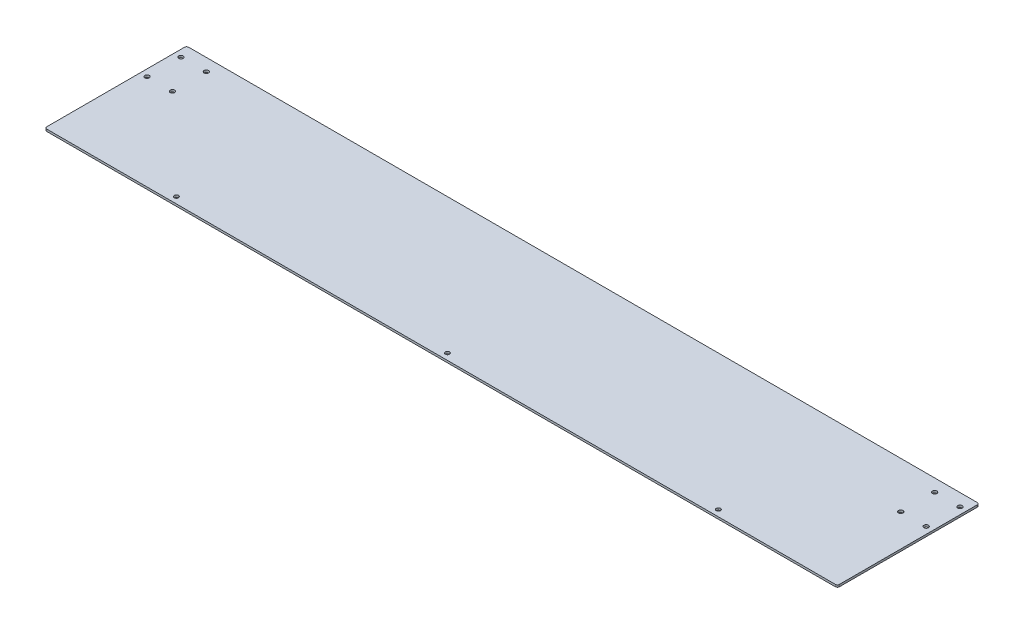
ISO-10303-21;
HEADER;
FILE_DESCRIPTION(('STEP AP214'),'2;1');
FILE_NAME('part.step','',(''),(''),'','','');
FILE_SCHEMA(('AUTOMOTIVE_DESIGN { 1 0 10303 214 1 1 1 1 }'));
ENDSEC;
DATA;
#1=APPLICATION_CONTEXT('core data for automotive mechanical design processes');
#2=APPLICATION_PROTOCOL_DEFINITION('international standard','automotive_design',2000,#1);
#3=PRODUCT_CONTEXT('',#1,'mechanical');
#4=PRODUCT('Part','Part','',(#3));
#5=PRODUCT_RELATED_PRODUCT_CATEGORY('part','',(#4));
#6=PRODUCT_DEFINITION_FORMATION('','',#4);
#7=PRODUCT_DEFINITION_CONTEXT('part definition',#1,'design');
#8=PRODUCT_DEFINITION('design','',#6,#7);
#9=PRODUCT_DEFINITION_SHAPE('','',#8);
#10=(LENGTH_UNIT() NAMED_UNIT(*) SI_UNIT(.MILLI.,.METRE.));
#11=(NAMED_UNIT(*) PLANE_ANGLE_UNIT() SI_UNIT($,.RADIAN.));
#12=(NAMED_UNIT(*) SI_UNIT($,.STERADIAN.) SOLID_ANGLE_UNIT());
#13=UNCERTAINTY_MEASURE_WITH_UNIT(LENGTH_MEASURE(1.E-05),#10,'distance_accuracy_value','');
#14=(GEOMETRIC_REPRESENTATION_CONTEXT(3) GLOBAL_UNCERTAINTY_ASSIGNED_CONTEXT((#13)) GLOBAL_UNIT_ASSIGNED_CONTEXT((#10,
#11,#12)) REPRESENTATION_CONTEXT('',''));
#15=CARTESIAN_POINT('',(0.,0.,0.));
#16=DIRECTION('',(0.,0.,1.));
#17=DIRECTION('',(1.,0.,0.));
#18=AXIS2_PLACEMENT_3D('',#15,#16,#17);
#19=CARTESIAN_POINT('',(591.185,3.175,-103.1875));
#20=DIRECTION('',(0.,-1.,0.));
#21=DIRECTION('',(0.,0.,-1.));
#22=AXIS2_PLACEMENT_3D('',#19,#20,#21);
#23=CYLINDRICAL_SURFACE('',#22,3.17500000000002);
#24=CARTESIAN_POINT('',(591.185,0.,-103.1875));
#25=DIRECTION('',(0.,1.,0.));
#26=DIRECTION('',(0.,0.,-1.));
#27=AXIS2_PLACEMENT_3D('',#24,#25,#26);
#28=CIRCLE('',#27,3.17500000000002);
#29=CARTESIAN_POINT('',(594.36,0.,-103.1875));
#30=VERTEX_POINT('',#29);
#31=CARTESIAN_POINT('',(591.185,0.,-106.3625));
#32=VERTEX_POINT('',#31);
#33=EDGE_CURVE('E132',#30,#32,#28,.T.);
#34=ORIENTED_EDGE('',*,*,#33,.T.);
#35=DIRECTION('',(0.,-1.,0.));
#36=VECTOR('',#35,1.);
#37=CARTESIAN_POINT('',(591.185,3.175,-106.3625));
#38=LINE('',#37,#36);
#39=CARTESIAN_POINT('',(591.185,3.175,-106.3625));
#40=VERTEX_POINT('',#39);
#41=EDGE_CURVE('E11',#40,#32,#38,.T.);
#42=ORIENTED_EDGE('',*,*,#41,.F.);
#43=CARTESIAN_POINT('',(591.185,3.175,-103.1875));
#44=DIRECTION('',(0.,1.,0.));
#45=DIRECTION('',(0.,0.,-1.));
#46=AXIS2_PLACEMENT_3D('',#43,#44,#45);
#47=CIRCLE('',#46,3.17500000000002);
#48=CARTESIAN_POINT('',(594.36,3.175,-103.1875));
#49=VERTEX_POINT('',#48);
#50=EDGE_CURVE('E147',#49,#40,#47,.T.);
#51=ORIENTED_EDGE('',*,*,#50,.F.);
#52=DIRECTION('',(0.,-1.,0.));
#53=VECTOR('',#52,1.);
#54=CARTESIAN_POINT('',(594.36,3.175,-103.1875));
#55=LINE('',#54,#53);
#56=EDGE_CURVE('E128',#49,#30,#55,.T.);
#57=ORIENTED_EDGE('',*,*,#56,.T.);
#58=EDGE_LOOP('',(#34,#42,#51,#57));
#59=FACE_BOUND('',#58,.T.);
#60=ADVANCED_FACE('F36',(#59),#23,.T.);
#61=CARTESIAN_POINT('',(-591.185,3.175,-106.3625));
#62=DIRECTION('',(0.,0.,1.));
#63=DIRECTION('',(1.,0.,0.));
#64=AXIS2_PLACEMENT_3D('',#61,#62,#63);
#65=PLANE('',#64);
#66=DIRECTION('',(-1.,0.,0.));
#67=VECTOR('',#66,1.);
#68=CARTESIAN_POINT('',(-591.185,0.,-106.3625));
#69=LINE('',#68,#67);
#70=CARTESIAN_POINT('',(-591.185,0.,-106.3625));
#71=VERTEX_POINT('',#70);
#72=EDGE_CURVE('E135',#32,#71,#69,.T.);
#73=ORIENTED_EDGE('',*,*,#72,.T.);
#74=DIRECTION('',(0.,-1.,0.));
#75=VECTOR('',#74,1.);
#76=CARTESIAN_POINT('',(-591.185,3.175,-106.3625));
#77=LINE('',#76,#75);
#78=CARTESIAN_POINT('',(-591.185,3.175,-106.3625));
#79=VERTEX_POINT('',#78);
#80=EDGE_CURVE('E44',#79,#71,#77,.T.);
#81=ORIENTED_EDGE('',*,*,#80,.F.);
#82=DIRECTION('',(-1.,0.,0.));
#83=VECTOR('',#82,1.);
#84=CARTESIAN_POINT('',(-591.185,3.175,-106.3625));
#85=LINE('',#84,#83);
#86=EDGE_CURVE('E95',#40,#79,#85,.T.);
#87=ORIENTED_EDGE('',*,*,#86,.F.);
#88=ORIENTED_EDGE('',*,*,#41,.T.);
#89=EDGE_LOOP('',(#73,#81,#87,#88));
#90=FACE_BOUND('',#89,.T.);
#91=ADVANCED_FACE('F288',(#90),#65,.F.);
#92=CARTESIAN_POINT('',(-591.185,3.175,-103.1875));
#93=DIRECTION('',(0.,-1.,0.));
#94=DIRECTION('',(0.,0.,-1.));
#95=AXIS2_PLACEMENT_3D('',#92,#93,#94);
#96=CYLINDRICAL_SURFACE('',#95,3.17500000000002);
#97=CARTESIAN_POINT('',(-591.185,0.,-103.1875));
#98=DIRECTION('',(0.,1.,0.));
#99=DIRECTION('',(0.,0.,-1.));
#100=AXIS2_PLACEMENT_3D('',#97,#98,#99);
#101=CIRCLE('',#100,3.17500000000002);
#102=CARTESIAN_POINT('',(-594.36,0.,-103.1875));
#103=VERTEX_POINT('',#102);
#104=EDGE_CURVE('E138',#71,#103,#101,.T.);
#105=ORIENTED_EDGE('',*,*,#104,.T.);
#106=DIRECTION('',(0.,-1.,0.));
#107=VECTOR('',#106,1.);
#108=CARTESIAN_POINT('',(-594.36,3.175,-103.1875));
#109=LINE('',#108,#107);
#110=CARTESIAN_POINT('',(-594.36,3.175,-103.1875));
#111=VERTEX_POINT('',#110);
#112=EDGE_CURVE('E154',#111,#103,#109,.T.);
#113=ORIENTED_EDGE('',*,*,#112,.F.);
#114=CARTESIAN_POINT('',(-591.185,3.175,-103.1875));
#115=DIRECTION('',(0.,1.,0.));
#116=DIRECTION('',(0.,0.,-1.));
#117=AXIS2_PLACEMENT_3D('',#114,#115,#116);
#118=CIRCLE('',#117,3.17500000000002);
#119=EDGE_CURVE('E162',#79,#111,#118,.T.);
#120=ORIENTED_EDGE('',*,*,#119,.F.);
#121=ORIENTED_EDGE('',*,*,#80,.T.);
#122=EDGE_LOOP('',(#105,#113,#120,#121));
#123=FACE_BOUND('',#122,.T.);
#124=ADVANCED_FACE('F160',(#123),#96,.T.);
#125=CARTESIAN_POINT('',(-594.36,3.175,103.1875));
#126=DIRECTION('',(1.,0.,0.));
#127=DIRECTION('',(0.,0.,-1.));
#128=AXIS2_PLACEMENT_3D('',#125,#126,#127);
#129=PLANE('',#128);
#130=DIRECTION('',(0.,0.,1.));
#131=VECTOR('',#130,1.);
#132=CARTESIAN_POINT('',(-594.36,0.,103.1875));
#133=LINE('',#132,#131);
#134=CARTESIAN_POINT('',(-594.36,0.,103.1875));
#135=VERTEX_POINT('',#134);
#136=EDGE_CURVE('E140',#103,#135,#133,.T.);
#137=ORIENTED_EDGE('',*,*,#136,.T.);
#138=DIRECTION('',(0.,-1.,0.));
#139=VECTOR('',#138,1.);
#140=CARTESIAN_POINT('',(-594.36,3.175,103.1875));
#141=LINE('',#140,#139);
#142=CARTESIAN_POINT('',(-594.36,3.175,103.1875));
#143=VERTEX_POINT('',#142);
#144=EDGE_CURVE('E151',#143,#135,#141,.T.);
#145=ORIENTED_EDGE('',*,*,#144,.F.);
#146=DIRECTION('',(0.,0.,1.));
#147=VECTOR('',#146,1.);
#148=CARTESIAN_POINT('',(-594.36,3.175,103.1875));
#149=LINE('',#148,#147);
#150=EDGE_CURVE('E174',#111,#143,#149,.T.);
#151=ORIENTED_EDGE('',*,*,#150,.F.);
#152=ORIENTED_EDGE('',*,*,#112,.T.);
#153=EDGE_LOOP('',(#137,#145,#151,#152));
#154=FACE_BOUND('',#153,.T.);
#155=ADVANCED_FACE('F170',(#154),#129,.F.);
#156=CARTESIAN_POINT('',(-591.185,3.175,103.1875));
#157=DIRECTION('',(0.,-1.,0.));
#158=DIRECTION('',(0.,0.,-1.));
#159=AXIS2_PLACEMENT_3D('',#156,#157,#158);
#160=CYLINDRICAL_SURFACE('',#159,3.17500000000002);
#161=CARTESIAN_POINT('',(-591.185,0.,103.1875));
#162=DIRECTION('',(0.,1.,0.));
#163=DIRECTION('',(0.,0.,-1.));
#164=AXIS2_PLACEMENT_3D('',#161,#162,#163);
#165=CIRCLE('',#164,3.17500000000002);
#166=CARTESIAN_POINT('',(-591.185,0.,106.3625));
#167=VERTEX_POINT('',#166);
#168=EDGE_CURVE('E142',#135,#167,#165,.T.);
#169=ORIENTED_EDGE('',*,*,#168,.T.);
#170=DIRECTION('',(0.,-1.,0.));
#171=VECTOR('',#170,1.);
#172=CARTESIAN_POINT('',(-591.185,3.175,106.3625));
#173=LINE('',#172,#171);
#174=CARTESIAN_POINT('',(-591.185,3.175,106.3625));
#175=VERTEX_POINT('',#174);
#176=EDGE_CURVE('E123',#175,#167,#173,.T.);
#177=ORIENTED_EDGE('',*,*,#176,.F.);
#178=CARTESIAN_POINT('',(-591.185,3.175,103.1875));
#179=DIRECTION('',(0.,1.,0.));
#180=DIRECTION('',(0.,0.,-1.));
#181=AXIS2_PLACEMENT_3D('',#178,#179,#180);
#182=CIRCLE('',#181,3.17500000000002);
#183=EDGE_CURVE('E114',#143,#175,#182,.T.);
#184=ORIENTED_EDGE('',*,*,#183,.F.);
#185=ORIENTED_EDGE('',*,*,#144,.T.);
#186=EDGE_LOOP('',(#169,#177,#184,#185));
#187=FACE_BOUND('',#186,.T.);
#188=ADVANCED_FACE('F173',(#187),#160,.T.);
#189=CARTESIAN_POINT('',(-591.185,3.175,106.3625));
#190=DIRECTION('',(0.,0.,-1.));
#191=DIRECTION('',(-1.,0.,0.));
#192=AXIS2_PLACEMENT_3D('',#189,#190,#191);
#193=PLANE('',#192);
#194=DIRECTION('',(1.,0.,0.));
#195=VECTOR('',#194,1.);
#196=CARTESIAN_POINT('',(-591.185,0.,106.3625));
#197=LINE('',#196,#195);
#198=CARTESIAN_POINT('',(591.185,0.,106.3625));
#199=VERTEX_POINT('',#198);
#200=EDGE_CURVE('E122',#167,#199,#197,.T.);
#201=ORIENTED_EDGE('',*,*,#200,.T.);
#202=DIRECTION('',(0.,-1.,0.));
#203=VECTOR('',#202,1.);
#204=CARTESIAN_POINT('',(591.185,3.175,106.3625));
#205=LINE('',#204,#203);
#206=CARTESIAN_POINT('',(591.185,3.175,106.3625));
#207=VERTEX_POINT('',#206);
#208=EDGE_CURVE('E119',#207,#199,#205,.T.);
#209=ORIENTED_EDGE('',*,*,#208,.F.);
#210=DIRECTION('',(1.,0.,0.));
#211=VECTOR('',#210,1.);
#212=CARTESIAN_POINT('',(-591.185,3.175,106.3625));
#213=LINE('',#212,#211);
#214=EDGE_CURVE('E108',#175,#207,#213,.T.);
#215=ORIENTED_EDGE('',*,*,#214,.F.);
#216=ORIENTED_EDGE('',*,*,#176,.T.);
#217=EDGE_LOOP('',(#201,#209,#215,#216));
#218=FACE_BOUND('',#217,.T.);
#219=ADVANCED_FACE('F120',(#218),#193,.F.);
#220=CARTESIAN_POINT('',(591.185,3.175,103.1875));
#221=DIRECTION('',(0.,-1.,0.));
#222=DIRECTION('',(0.,0.,-1.));
#223=AXIS2_PLACEMENT_3D('',#220,#221,#222);
#224=CYLINDRICAL_SURFACE('',#223,3.17500000000002);
#225=CARTESIAN_POINT('',(591.185,0.,103.1875));
#226=DIRECTION('',(0.,1.,0.));
#227=DIRECTION('',(0.,0.,1.));
#228=AXIS2_PLACEMENT_3D('',#225,#226,#227);
#229=CIRCLE('',#228,3.17500000000002);
#230=CARTESIAN_POINT('',(594.36,0.,103.1875));
#231=VERTEX_POINT('',#230);
#232=EDGE_CURVE('E81',#199,#231,#229,.T.);
#233=ORIENTED_EDGE('',*,*,#232,.T.);
#234=DIRECTION('',(0.,-1.,0.));
#235=VECTOR('',#234,1.);
#236=CARTESIAN_POINT('',(594.36,3.175,103.1875));
#237=LINE('',#236,#235);
#238=CARTESIAN_POINT('',(594.36,3.175,103.1875));
#239=VERTEX_POINT('',#238);
#240=EDGE_CURVE('E124',#239,#231,#237,.T.);
#241=ORIENTED_EDGE('',*,*,#240,.F.);
#242=CARTESIAN_POINT('',(591.185,3.175,103.1875));
#243=DIRECTION('',(0.,1.,0.));
#244=DIRECTION('',(0.,0.,1.));
#245=AXIS2_PLACEMENT_3D('',#242,#243,#244);
#246=CIRCLE('',#245,3.17500000000002);
#247=EDGE_CURVE('E112',#207,#239,#246,.T.);
#248=ORIENTED_EDGE('',*,*,#247,.F.);
#249=ORIENTED_EDGE('',*,*,#208,.T.);
#250=EDGE_LOOP('',(#233,#241,#248,#249));
#251=FACE_BOUND('',#250,.T.);
#252=ADVANCED_FACE('F126',(#251),#224,.T.);
#253=CARTESIAN_POINT('',(594.36,3.175,103.1875));
#254=DIRECTION('',(-1.,0.,0.));
#255=DIRECTION('',(0.,0.,1.));
#256=AXIS2_PLACEMENT_3D('',#253,#254,#255);
#257=PLANE('',#256);
#258=DIRECTION('',(0.,0.,-1.));
#259=VECTOR('',#258,1.);
#260=CARTESIAN_POINT('',(594.36,0.,103.1875));
#261=LINE('',#260,#259);
#262=EDGE_CURVE('E87',#231,#30,#261,.T.);
#263=ORIENTED_EDGE('',*,*,#262,.T.);
#264=ORIENTED_EDGE('',*,*,#56,.F.);
#265=DIRECTION('',(0.,0.,-1.));
#266=VECTOR('',#265,1.);
#267=CARTESIAN_POINT('',(594.36,3.175,103.1875));
#268=LINE('',#267,#266);
#269=EDGE_CURVE('E52',#239,#49,#268,.T.);
#270=ORIENTED_EDGE('',*,*,#269,.F.);
#271=ORIENTED_EDGE('',*,*,#240,.T.);
#272=EDGE_LOOP('',(#263,#264,#270,#271));
#273=FACE_BOUND('',#272,.T.);
#274=ADVANCED_FACE('F250',(#273),#257,.F.);
#275=CARTESIAN_POINT('',(591.185,3.175,-103.1875));
#276=DIRECTION('',(0.,-1.,0.));
#277=DIRECTION('',(0.,0.,-1.));
#278=AXIS2_PLACEMENT_3D('',#275,#276,#277);
#279=PLANE('',#278);
#280=CARTESIAN_POINT('',(-546.1,3.175,-36.9087399999999));
#281=DIRECTION('',(0.,1.,0.));
#282=DIRECTION('',(0.,0.,1.));
#283=AXIS2_PLACEMENT_3D('',#280,#281,#282);
#284=CIRCLE('',#283,3.373501);
#285=CARTESIAN_POINT('',(-546.1,3.175,-33.5352389999999));
#286=VERTEX_POINT('',#285);
#287=EDGE_CURVE('E242',#286,#286,#284,.T.);
#288=ORIENTED_EDGE('',*,*,#287,.F.);
#289=EDGE_LOOP('',(#288));
#290=FACE_BOUND('',#289,.T.);
#291=CARTESIAN_POINT('',(-546.1,3.175,-87.7087399999999));
#292=DIRECTION('',(0.,1.,0.));
#293=DIRECTION('',(0.,0.,1.));
#294=AXIS2_PLACEMENT_3D('',#291,#292,#293);
#295=CIRCLE('',#294,3.373501);
#296=CARTESIAN_POINT('',(-546.1,3.175,-84.3352389999999));
#297=VERTEX_POINT('',#296);
#298=EDGE_CURVE('E236',#297,#297,#295,.T.);
#299=ORIENTED_EDGE('',*,*,#298,.F.);
#300=EDGE_LOOP('',(#299));
#301=FACE_BOUND('',#300,.T.);
#302=CARTESIAN_POINT('',(-584.2,3.175,-87.7087399999998));
#303=DIRECTION('',(0.,1.,0.));
#304=DIRECTION('',(0.,0.,1.));
#305=AXIS2_PLACEMENT_3D('',#302,#303,#304);
#306=CIRCLE('',#305,3.373501);
#307=CARTESIAN_POINT('',(-584.2,3.175,-84.3352389999999));
#308=VERTEX_POINT('',#307);
#309=EDGE_CURVE('E230',#308,#308,#306,.T.);
#310=ORIENTED_EDGE('',*,*,#309,.F.);
#311=EDGE_LOOP('',(#310));
#312=FACE_BOUND('',#311,.T.);
#313=CARTESIAN_POINT('',(-584.2,3.175,-36.9087399999999));
#314=DIRECTION('',(0.,1.,0.));
#315=DIRECTION('',(0.,0.,1.));
#316=AXIS2_PLACEMENT_3D('',#313,#314,#315);
#317=CIRCLE('',#316,3.373501);
#318=CARTESIAN_POINT('',(-584.2,3.175,-33.5352389999999));
#319=VERTEX_POINT('',#318);
#320=EDGE_CURVE('E224',#319,#319,#317,.T.);
#321=ORIENTED_EDGE('',*,*,#320,.F.);
#322=EDGE_LOOP('',(#321));
#323=FACE_BOUND('',#322,.T.);
#324=CARTESIAN_POINT('',(584.2,3.175,-36.90874));
#325=DIRECTION('',(0.,1.,0.));
#326=DIRECTION('',(0.,0.,1.));
#327=AXIS2_PLACEMENT_3D('',#324,#325,#326);
#328=CIRCLE('',#327,3.373501);
#329=CARTESIAN_POINT('',(584.2,3.175,-33.535239));
#330=VERTEX_POINT('',#329);
#331=EDGE_CURVE('E218',#330,#330,#328,.T.);
#332=ORIENTED_EDGE('',*,*,#331,.F.);
#333=EDGE_LOOP('',(#332));
#334=FACE_BOUND('',#333,.T.);
#335=CARTESIAN_POINT('',(546.1,3.175,-36.9087399999999));
#336=DIRECTION('',(0.,1.,0.));
#337=DIRECTION('',(0.,0.,1.));
#338=AXIS2_PLACEMENT_3D('',#335,#336,#337);
#339=CIRCLE('',#338,3.373501);
#340=CARTESIAN_POINT('',(546.1,3.175,-33.5352389999999));
#341=VERTEX_POINT('',#340);
#342=EDGE_CURVE('E212',#341,#341,#339,.T.);
#343=ORIENTED_EDGE('',*,*,#342,.F.);
#344=EDGE_LOOP('',(#343));
#345=FACE_BOUND('',#344,.T.);
#346=CARTESIAN_POINT('',(546.1,3.175,-87.7087399999999));
#347=DIRECTION('',(0.,1.,0.));
#348=DIRECTION('',(0.,0.,1.));
#349=AXIS2_PLACEMENT_3D('',#346,#347,#348);
#350=CIRCLE('',#349,3.373501);
#351=CARTESIAN_POINT('',(546.1,3.175,-84.3352389999999));
#352=VERTEX_POINT('',#351);
#353=EDGE_CURVE('E206',#352,#352,#350,.T.);
#354=ORIENTED_EDGE('',*,*,#353,.F.);
#355=EDGE_LOOP('',(#354));
#356=FACE_BOUND('',#355,.T.);
#357=CARTESIAN_POINT('',(584.2,3.175,-87.70874));
#358=DIRECTION('',(0.,1.,0.));
#359=DIRECTION('',(0.,0.,1.));
#360=AXIS2_PLACEMENT_3D('',#357,#358,#359);
#361=CIRCLE('',#360,3.373501);
#362=CARTESIAN_POINT('',(584.2,3.175,-84.335239));
#363=VERTEX_POINT('',#362);
#364=EDGE_CURVE('E200',#363,#363,#361,.T.);
#365=ORIENTED_EDGE('',*,*,#364,.F.);
#366=EDGE_LOOP('',(#365));
#367=FACE_BOUND('',#366,.T.);
#368=CARTESIAN_POINT('',(0.,3.175,96.8375));
#369=DIRECTION('',(0.,1.,0.));
#370=DIRECTION('',(0.,0.,1.));
#371=AXIS2_PLACEMENT_3D('',#368,#369,#370);
#372=CIRCLE('',#371,3.175);
#373=CARTESIAN_POINT('',(0.,3.175,100.0125));
#374=VERTEX_POINT('',#373);
#375=EDGE_CURVE('E194',#374,#374,#372,.T.);
#376=ORIENTED_EDGE('',*,*,#375,.F.);
#377=EDGE_LOOP('',(#376));
#378=FACE_BOUND('',#377,.T.);
#379=CARTESIAN_POINT('',(-406.4,3.175,96.8375));
#380=DIRECTION('',(0.,1.,0.));
#381=DIRECTION('',(0.,0.,1.));
#382=AXIS2_PLACEMENT_3D('',#379,#380,#381);
#383=CIRCLE('',#382,3.17499999999998);
#384=CARTESIAN_POINT('',(-406.4,3.175,100.0125));
#385=VERTEX_POINT('',#384);
#386=EDGE_CURVE('E188',#385,#385,#383,.T.);
#387=ORIENTED_EDGE('',*,*,#386,.F.);
#388=EDGE_LOOP('',(#387));
#389=FACE_BOUND('',#388,.T.);
#390=CARTESIAN_POINT('',(406.4,3.175,96.8375));
#391=DIRECTION('',(0.,1.,0.));
#392=DIRECTION('',(0.,0.,1.));
#393=AXIS2_PLACEMENT_3D('',#390,#391,#392);
#394=CIRCLE('',#393,3.17499999999998);
#395=CARTESIAN_POINT('',(406.4,3.175,100.0125));
#396=VERTEX_POINT('',#395);
#397=EDGE_CURVE('E182',#396,#396,#394,.T.);
#398=ORIENTED_EDGE('',*,*,#397,.F.);
#399=EDGE_LOOP('',(#398));
#400=FACE_BOUND('',#399,.T.);
#401=ORIENTED_EDGE('',*,*,#50,.T.);
#402=ORIENTED_EDGE('',*,*,#86,.T.);
#403=ORIENTED_EDGE('',*,*,#119,.T.);
#404=ORIENTED_EDGE('',*,*,#150,.T.);
#405=ORIENTED_EDGE('',*,*,#183,.T.);
#406=ORIENTED_EDGE('',*,*,#214,.T.);
#407=ORIENTED_EDGE('',*,*,#247,.T.);
#408=ORIENTED_EDGE('',*,*,#269,.T.);
#409=EDGE_LOOP('',(#401,#402,#403,#404,#405,#406,#407,#408));
#410=FACE_BOUND('',#409,.T.);
#411=ADVANCED_FACE('F110',(#290,#301,#312,#323,#334,#345,#356,#367,#378,#389,#400,#410),#279,.F.);
#412=CARTESIAN_POINT('',(591.185,0.,-103.1875));
#413=DIRECTION('',(0.,-1.,0.));
#414=DIRECTION('',(0.,0.,-1.));
#415=AXIS2_PLACEMENT_3D('',#412,#413,#414);
#416=PLANE('',#415);
#417=CARTESIAN_POINT('',(-546.1,0.,-36.9087399999999));
#418=DIRECTION('',(0.,1.,0.));
#419=DIRECTION('',(0.,0.,1.));
#420=AXIS2_PLACEMENT_3D('',#417,#418,#419);
#421=CIRCLE('',#420,3.373501);
#422=CARTESIAN_POINT('',(-546.1,0.,-33.5352389999999));
#423=VERTEX_POINT('',#422);
#424=EDGE_CURVE('E239',#423,#423,#421,.T.);
#425=ORIENTED_EDGE('',*,*,#424,.T.);
#426=EDGE_LOOP('',(#425));
#427=FACE_BOUND('',#426,.T.);
#428=CARTESIAN_POINT('',(-546.1,0.,-87.7087399999999));
#429=DIRECTION('',(0.,1.,0.));
#430=DIRECTION('',(0.,0.,1.));
#431=AXIS2_PLACEMENT_3D('',#428,#429,#430);
#432=CIRCLE('',#431,3.373501);
#433=CARTESIAN_POINT('',(-546.1,0.,-84.3352389999999));
#434=VERTEX_POINT('',#433);
#435=EDGE_CURVE('E233',#434,#434,#432,.T.);
#436=ORIENTED_EDGE('',*,*,#435,.T.);
#437=EDGE_LOOP('',(#436));
#438=FACE_BOUND('',#437,.T.);
#439=CARTESIAN_POINT('',(-584.2,0.,-87.7087399999998));
#440=DIRECTION('',(0.,1.,0.));
#441=DIRECTION('',(0.,0.,1.));
#442=AXIS2_PLACEMENT_3D('',#439,#440,#441);
#443=CIRCLE('',#442,3.373501);
#444=CARTESIAN_POINT('',(-584.2,0.,-84.3352389999999));
#445=VERTEX_POINT('',#444);
#446=EDGE_CURVE('E227',#445,#445,#443,.T.);
#447=ORIENTED_EDGE('',*,*,#446,.T.);
#448=EDGE_LOOP('',(#447));
#449=FACE_BOUND('',#448,.T.);
#450=CARTESIAN_POINT('',(-584.2,0.,-36.9087399999999));
#451=DIRECTION('',(0.,1.,0.));
#452=DIRECTION('',(0.,0.,1.));
#453=AXIS2_PLACEMENT_3D('',#450,#451,#452);
#454=CIRCLE('',#453,3.373501);
#455=CARTESIAN_POINT('',(-584.2,0.,-33.5352389999999));
#456=VERTEX_POINT('',#455);
#457=EDGE_CURVE('E221',#456,#456,#454,.T.);
#458=ORIENTED_EDGE('',*,*,#457,.T.);
#459=EDGE_LOOP('',(#458));
#460=FACE_BOUND('',#459,.T.);
#461=CARTESIAN_POINT('',(584.2,0.,-36.90874));
#462=DIRECTION('',(0.,1.,0.));
#463=DIRECTION('',(0.,0.,1.));
#464=AXIS2_PLACEMENT_3D('',#461,#462,#463);
#465=CIRCLE('',#464,3.373501);
#466=CARTESIAN_POINT('',(584.2,0.,-33.535239));
#467=VERTEX_POINT('',#466);
#468=EDGE_CURVE('E215',#467,#467,#465,.T.);
#469=ORIENTED_EDGE('',*,*,#468,.T.);
#470=EDGE_LOOP('',(#469));
#471=FACE_BOUND('',#470,.T.);
#472=CARTESIAN_POINT('',(546.1,0.,-36.9087399999999));
#473=DIRECTION('',(0.,1.,0.));
#474=DIRECTION('',(0.,0.,1.));
#475=AXIS2_PLACEMENT_3D('',#472,#473,#474);
#476=CIRCLE('',#475,3.373501);
#477=CARTESIAN_POINT('',(546.1,0.,-33.5352389999999));
#478=VERTEX_POINT('',#477);
#479=EDGE_CURVE('E209',#478,#478,#476,.T.);
#480=ORIENTED_EDGE('',*,*,#479,.T.);
#481=EDGE_LOOP('',(#480));
#482=FACE_BOUND('',#481,.T.);
#483=CARTESIAN_POINT('',(546.1,0.,-87.7087399999999));
#484=DIRECTION('',(0.,1.,0.));
#485=DIRECTION('',(0.,0.,1.));
#486=AXIS2_PLACEMENT_3D('',#483,#484,#485);
#487=CIRCLE('',#486,3.373501);
#488=CARTESIAN_POINT('',(546.1,0.,-84.3352389999999));
#489=VERTEX_POINT('',#488);
#490=EDGE_CURVE('E203',#489,#489,#487,.T.);
#491=ORIENTED_EDGE('',*,*,#490,.T.);
#492=EDGE_LOOP('',(#491));
#493=FACE_BOUND('',#492,.T.);
#494=CARTESIAN_POINT('',(584.2,0.,-87.70874));
#495=DIRECTION('',(0.,1.,0.));
#496=DIRECTION('',(0.,0.,1.));
#497=AXIS2_PLACEMENT_3D('',#494,#495,#496);
#498=CIRCLE('',#497,3.373501);
#499=CARTESIAN_POINT('',(584.2,0.,-84.335239));
#500=VERTEX_POINT('',#499);
#501=EDGE_CURVE('E197',#500,#500,#498,.T.);
#502=ORIENTED_EDGE('',*,*,#501,.T.);
#503=EDGE_LOOP('',(#502));
#504=FACE_BOUND('',#503,.T.);
#505=CARTESIAN_POINT('',(0.,0.,96.8375));
#506=DIRECTION('',(0.,1.,0.));
#507=DIRECTION('',(0.,0.,1.));
#508=AXIS2_PLACEMENT_3D('',#505,#506,#507);
#509=CIRCLE('',#508,3.175);
#510=CARTESIAN_POINT('',(0.,0.,100.0125));
#511=VERTEX_POINT('',#510);
#512=EDGE_CURVE('E191',#511,#511,#509,.T.);
#513=ORIENTED_EDGE('',*,*,#512,.T.);
#514=EDGE_LOOP('',(#513));
#515=FACE_BOUND('',#514,.T.);
#516=CARTESIAN_POINT('',(-406.4,0.,96.8375));
#517=DIRECTION('',(0.,1.,0.));
#518=DIRECTION('',(0.,0.,1.));
#519=AXIS2_PLACEMENT_3D('',#516,#517,#518);
#520=CIRCLE('',#519,3.17499999999998);
#521=CARTESIAN_POINT('',(-406.4,0.,100.0125));
#522=VERTEX_POINT('',#521);
#523=EDGE_CURVE('E185',#522,#522,#520,.T.);
#524=ORIENTED_EDGE('',*,*,#523,.T.);
#525=EDGE_LOOP('',(#524));
#526=FACE_BOUND('',#525,.T.);
#527=CARTESIAN_POINT('',(406.4,0.,96.8375));
#528=DIRECTION('',(0.,1.,0.));
#529=DIRECTION('',(0.,0.,1.));
#530=AXIS2_PLACEMENT_3D('',#527,#528,#529);
#531=CIRCLE('',#530,3.17499999999998);
#532=CARTESIAN_POINT('',(406.4,0.,100.0125));
#533=VERTEX_POINT('',#532);
#534=EDGE_CURVE('E136',#533,#533,#531,.T.);
#535=ORIENTED_EDGE('',*,*,#534,.T.);
#536=EDGE_LOOP('',(#535));
#537=FACE_BOUND('',#536,.T.);
#538=ORIENTED_EDGE('',*,*,#33,.F.);
#539=ORIENTED_EDGE('',*,*,#262,.F.);
#540=ORIENTED_EDGE('',*,*,#232,.F.);
#541=ORIENTED_EDGE('',*,*,#200,.F.);
#542=ORIENTED_EDGE('',*,*,#168,.F.);
#543=ORIENTED_EDGE('',*,*,#136,.F.);
#544=ORIENTED_EDGE('',*,*,#104,.F.);
#545=ORIENTED_EDGE('',*,*,#72,.F.);
#546=EDGE_LOOP('',(#538,#539,#540,#541,#542,#543,#544,#545));
#547=FACE_BOUND('',#546,.T.);
#548=ADVANCED_FACE('F166',(#427,#438,#449,#460,#471,#482,#493,#504,#515,#526,#537,#547),#416,.T.);
#549=CARTESIAN_POINT('',(406.4,3.175,96.8375));
#550=DIRECTION('',(0.,1.,0.));
#551=DIRECTION('',(0.,0.,1.));
#552=AXIS2_PLACEMENT_3D('',#549,#550,#551);
#553=CYLINDRICAL_SURFACE('',#552,3.17499999999998);
#554=ORIENTED_EDGE('',*,*,#534,.F.);
#555=EDGE_LOOP('',(#554));
#556=FACE_BOUND('',#555,.T.);
#557=ORIENTED_EDGE('',*,*,#397,.T.);
#558=EDGE_LOOP('',(#557));
#559=FACE_BOUND('',#558,.T.);
#560=ADVANCED_FACE('F272',(#556,#559),#553,.F.);
#561=CARTESIAN_POINT('',(-406.4,3.175,96.8375));
#562=DIRECTION('',(0.,1.,0.));
#563=DIRECTION('',(0.,0.,1.));
#564=AXIS2_PLACEMENT_3D('',#561,#562,#563);
#565=CYLINDRICAL_SURFACE('',#564,3.17499999999998);
#566=ORIENTED_EDGE('',*,*,#523,.F.);
#567=EDGE_LOOP('',(#566));
#568=FACE_BOUND('',#567,.T.);
#569=ORIENTED_EDGE('',*,*,#386,.T.);
#570=EDGE_LOOP('',(#569));
#571=FACE_BOUND('',#570,.T.);
#572=ADVANCED_FACE('F274',(#568,#571),#565,.F.);
#573=CARTESIAN_POINT('',(0.,3.175,96.8375));
#574=DIRECTION('',(0.,1.,0.));
#575=DIRECTION('',(0.,0.,1.));
#576=AXIS2_PLACEMENT_3D('',#573,#574,#575);
#577=CYLINDRICAL_SURFACE('',#576,3.175);
#578=ORIENTED_EDGE('',*,*,#512,.F.);
#579=EDGE_LOOP('',(#578));
#580=FACE_BOUND('',#579,.T.);
#581=ORIENTED_EDGE('',*,*,#375,.T.);
#582=EDGE_LOOP('',(#581));
#583=FACE_BOUND('',#582,.T.);
#584=ADVANCED_FACE('F281',(#580,#583),#577,.F.);
#585=CARTESIAN_POINT('',(584.2,3.175,-87.70874));
#586=DIRECTION('',(0.,1.,0.));
#587=DIRECTION('',(0.,0.,1.));
#588=AXIS2_PLACEMENT_3D('',#585,#586,#587);
#589=CYLINDRICAL_SURFACE('',#588,3.373501);
#590=ORIENTED_EDGE('',*,*,#501,.F.);
#591=EDGE_LOOP('',(#590));
#592=FACE_BOUND('',#591,.T.);
#593=ORIENTED_EDGE('',*,*,#364,.T.);
#594=EDGE_LOOP('',(#593));
#595=FACE_BOUND('',#594,.T.);
#596=ADVANCED_FACE('F354',(#592,#595),#589,.F.);
#597=CARTESIAN_POINT('',(546.1,3.175,-87.7087399999999));
#598=DIRECTION('',(0.,1.,0.));
#599=DIRECTION('',(0.,0.,1.));
#600=AXIS2_PLACEMENT_3D('',#597,#598,#599);
#601=CYLINDRICAL_SURFACE('',#600,3.373501);
#602=ORIENTED_EDGE('',*,*,#490,.F.);
#603=EDGE_LOOP('',(#602));
#604=FACE_BOUND('',#603,.T.);
#605=ORIENTED_EDGE('',*,*,#353,.T.);
#606=EDGE_LOOP('',(#605));
#607=FACE_BOUND('',#606,.T.);
#608=ADVANCED_FACE('F374',(#604,#607),#601,.F.);
#609=CARTESIAN_POINT('',(546.1,3.175,-36.9087399999999));
#610=DIRECTION('',(0.,1.,0.));
#611=DIRECTION('',(0.,0.,1.));
#612=AXIS2_PLACEMENT_3D('',#609,#610,#611);
#613=CYLINDRICAL_SURFACE('',#612,3.373501);
#614=ORIENTED_EDGE('',*,*,#479,.F.);
#615=EDGE_LOOP('',(#614));
#616=FACE_BOUND('',#615,.T.);
#617=ORIENTED_EDGE('',*,*,#342,.T.);
#618=EDGE_LOOP('',(#617));
#619=FACE_BOUND('',#618,.T.);
#620=ADVANCED_FACE('F384',(#616,#619),#613,.F.);
#621=CARTESIAN_POINT('',(584.2,3.175,-36.90874));
#622=DIRECTION('',(0.,1.,0.));
#623=DIRECTION('',(0.,0.,1.));
#624=AXIS2_PLACEMENT_3D('',#621,#622,#623);
#625=CYLINDRICAL_SURFACE('',#624,3.373501);
#626=ORIENTED_EDGE('',*,*,#468,.F.);
#627=EDGE_LOOP('',(#626));
#628=FACE_BOUND('',#627,.T.);
#629=ORIENTED_EDGE('',*,*,#331,.T.);
#630=EDGE_LOOP('',(#629));
#631=FACE_BOUND('',#630,.T.);
#632=ADVANCED_FACE('F394',(#628,#631),#625,.F.);
#633=CARTESIAN_POINT('',(-584.2,3.175,-36.9087399999999));
#634=DIRECTION('',(0.,1.,0.));
#635=DIRECTION('',(0.,0.,1.));
#636=AXIS2_PLACEMENT_3D('',#633,#634,#635);
#637=CYLINDRICAL_SURFACE('',#636,3.373501);
#638=ORIENTED_EDGE('',*,*,#457,.F.);
#639=EDGE_LOOP('',(#638));
#640=FACE_BOUND('',#639,.T.);
#641=ORIENTED_EDGE('',*,*,#320,.T.);
#642=EDGE_LOOP('',(#641));
#643=FACE_BOUND('',#642,.T.);
#644=ADVANCED_FACE('F404',(#640,#643),#637,.F.);
#645=CARTESIAN_POINT('',(-584.2,3.175,-87.7087399999998));
#646=DIRECTION('',(0.,1.,0.));
#647=DIRECTION('',(0.,0.,1.));
#648=AXIS2_PLACEMENT_3D('',#645,#646,#647);
#649=CYLINDRICAL_SURFACE('',#648,3.373501);
#650=ORIENTED_EDGE('',*,*,#446,.F.);
#651=EDGE_LOOP('',(#650));
#652=FACE_BOUND('',#651,.T.);
#653=ORIENTED_EDGE('',*,*,#309,.T.);
#654=EDGE_LOOP('',(#653));
#655=FACE_BOUND('',#654,.T.);
#656=ADVANCED_FACE('F414',(#652,#655),#649,.F.);
#657=CARTESIAN_POINT('',(-546.1,3.175,-87.7087399999999));
#658=DIRECTION('',(0.,1.,0.));
#659=DIRECTION('',(0.,0.,1.));
#660=AXIS2_PLACEMENT_3D('',#657,#658,#659);
#661=CYLINDRICAL_SURFACE('',#660,3.373501);
#662=ORIENTED_EDGE('',*,*,#435,.F.);
#663=EDGE_LOOP('',(#662));
#664=FACE_BOUND('',#663,.T.);
#665=ORIENTED_EDGE('',*,*,#298,.T.);
#666=EDGE_LOOP('',(#665));
#667=FACE_BOUND('',#666,.T.);
#668=ADVANCED_FACE('F424',(#664,#667),#661,.F.);
#669=CARTESIAN_POINT('',(-546.1,3.175,-36.9087399999999));
#670=DIRECTION('',(0.,1.,0.));
#671=DIRECTION('',(0.,0.,1.));
#672=AXIS2_PLACEMENT_3D('',#669,#670,#671);
#673=CYLINDRICAL_SURFACE('',#672,3.373501);
#674=ORIENTED_EDGE('',*,*,#424,.F.);
#675=EDGE_LOOP('',(#674));
#676=FACE_BOUND('',#675,.T.);
#677=ORIENTED_EDGE('',*,*,#287,.T.);
#678=EDGE_LOOP('',(#677));
#679=FACE_BOUND('',#678,.T.);
#680=ADVANCED_FACE('F246',(#676,#679),#673,.F.);
#681=CLOSED_SHELL('',(#60,#91,#124,#155,#188,#219,#252,#274,#411,#548,#560,#572,#584,#596,#608,
#620,#632,#644,#656,#668,#680));
#682=MANIFOLD_SOLID_BREP('B2',#681);
#683=ADVANCED_BREP_SHAPE_REPRESENTATION('',(#18,#682),#14);
#684=SHAPE_DEFINITION_REPRESENTATION(#9,#683);
ENDSEC;
END-ISO-10303-21;
